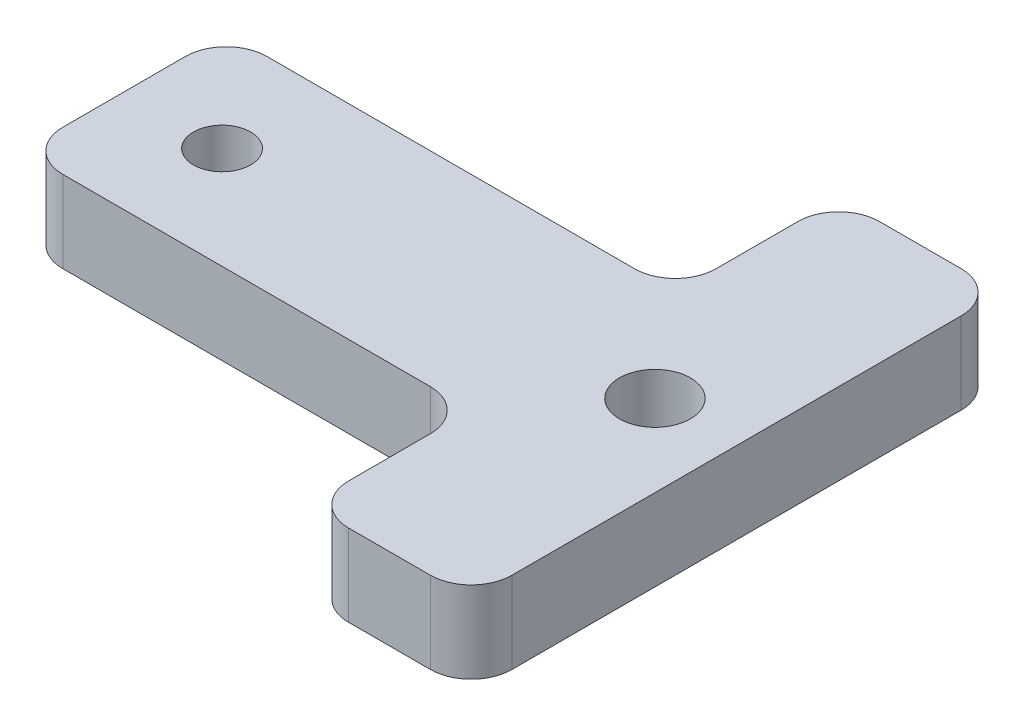
ISO-10303-21;
HEADER;
FILE_DESCRIPTION(('STEP AP214'),'2;1');
FILE_NAME('part.step','',(''),(''),'','','');
FILE_SCHEMA(('AUTOMOTIVE_DESIGN { 1 0 10303 214 1 1 1 1 }'));
ENDSEC;
DATA;
#1=APPLICATION_CONTEXT('core data for automotive mechanical design processes');
#2=APPLICATION_PROTOCOL_DEFINITION('international standard','automotive_design',2000,#1);
#3=PRODUCT_CONTEXT('',#1,'mechanical');
#4=PRODUCT('Part','Part','',(#3));
#5=PRODUCT_RELATED_PRODUCT_CATEGORY('part','',(#4));
#6=PRODUCT_DEFINITION_FORMATION('','',#4);
#7=PRODUCT_DEFINITION_CONTEXT('part definition',#1,'design');
#8=PRODUCT_DEFINITION('design','',#6,#7);
#9=PRODUCT_DEFINITION_SHAPE('','',#8);
#10=(LENGTH_UNIT() NAMED_UNIT(*) SI_UNIT(.MILLI.,.METRE.));
#11=(NAMED_UNIT(*) PLANE_ANGLE_UNIT() SI_UNIT($,.RADIAN.));
#12=(NAMED_UNIT(*) SI_UNIT($,.STERADIAN.) SOLID_ANGLE_UNIT());
#13=UNCERTAINTY_MEASURE_WITH_UNIT(LENGTH_MEASURE(1.E-05),#10,'distance_accuracy_value','');
#14=(GEOMETRIC_REPRESENTATION_CONTEXT(3) GLOBAL_UNCERTAINTY_ASSIGNED_CONTEXT((#13)) GLOBAL_UNIT_ASSIGNED_CONTEXT((#10,
#11,#12)) REPRESENTATION_CONTEXT('',''));
#15=CARTESIAN_POINT('',(0.,0.,0.));
#16=DIRECTION('',(0.,0.,1.));
#17=DIRECTION('',(1.,0.,0.));
#18=AXIS2_PLACEMENT_3D('',#15,#16,#17);
#19=CARTESIAN_POINT('',(-25.5,-0.000999999999999265,0.));
#20=DIRECTION('',(0.,1.,0.));
#21=DIRECTION('',(0.,0.,1.));
#22=AXIS2_PLACEMENT_3D('',#19,#20,#21);
#23=CYLINDRICAL_SURFACE('',#22,3.50000000000001);
#24=CARTESIAN_POINT('',(-25.5,10.,0.));
#25=DIRECTION('',(0.,1.,0.));
#26=DIRECTION('',(0.,0.,1.));
#27=AXIS2_PLACEMENT_3D('',#24,#25,#26);
#28=CIRCLE('',#27,3.50000000000001);
#29=CARTESIAN_POINT('',(-25.5,10.,3.50000000000001));
#30=VERTEX_POINT('',#29);
#31=EDGE_CURVE('E329',#30,#30,#28,.T.);
#32=ORIENTED_EDGE('',*,*,#31,.T.);
#33=EDGE_LOOP('',(#32));
#34=FACE_BOUND('',#33,.T.);
#35=CARTESIAN_POINT('',(-25.5,4.,0.));
#36=DIRECTION('',(0.,-1.,0.));
#37=DIRECTION('',(0.,0.,-1.));
#38=AXIS2_PLACEMENT_3D('',#35,#36,#37);
#39=CIRCLE('',#38,3.50000000000001);
#40=CARTESIAN_POINT('',(-25.5,4.,-3.50000000000001));
#41=VERTEX_POINT('',#40);
#42=EDGE_CURVE('E45',#41,#41,#39,.F.);
#43=ORIENTED_EDGE('',*,*,#42,.F.);
#44=EDGE_LOOP('',(#43));
#45=FACE_BOUND('',#44,.T.);
#46=ADVANCED_FACE('F41',(#34,#45),#23,.F.);
#47=CARTESIAN_POINT('',(17.5,10.,0.));
#48=DIRECTION('',(-1.,0.,0.));
#49=DIRECTION('',(0.,0.,1.));
#50=AXIS2_PLACEMENT_3D('',#47,#48,#49);
#51=PLANE('',#50);
#52=DIRECTION('',(0.,0.,-1.));
#53=VECTOR('',#52,1.);
#54=CARTESIAN_POINT('',(17.5,10.,0.));
#55=LINE('',#54,#53);
#56=CARTESIAN_POINT('',(17.5,10.,-17.5));
#57=VERTEX_POINT('',#56);
#58=CARTESIAN_POINT('',(17.5,10.,-27.5));
#59=VERTEX_POINT('',#58);
#60=EDGE_CURVE('E186',#57,#59,#55,.T.);
#61=ORIENTED_EDGE('',*,*,#60,.T.);
#62=DIRECTION('',(0.,-1.,0.));
#63=VECTOR('',#62,1.);
#64=CARTESIAN_POINT('',(17.5,0.,-27.5));
#65=LINE('',#64,#63);
#66=CARTESIAN_POINT('',(17.5,0.,-27.5));
#67=VERTEX_POINT('',#66);
#68=EDGE_CURVE('E238',#59,#67,#65,.T.);
#69=ORIENTED_EDGE('',*,*,#68,.T.);
#70=DIRECTION('',(0.,0.,-1.));
#71=VECTOR('',#70,1.);
#72=CARTESIAN_POINT('',(17.5,0.,0.));
#73=LINE('',#72,#71);
#74=CARTESIAN_POINT('',(17.5,0.,-17.5));
#75=VERTEX_POINT('',#74);
#76=EDGE_CURVE('E325',#75,#67,#73,.T.);
#77=ORIENTED_EDGE('',*,*,#76,.F.);
#78=DIRECTION('',(0.,-1.,0.));
#79=VECTOR('',#78,1.);
#80=CARTESIAN_POINT('',(17.5,10.,-17.5));
#81=LINE('',#80,#79);
#82=EDGE_CURVE('E235',#75,#57,#81,.F.);
#83=ORIENTED_EDGE('',*,*,#82,.T.);
#84=EDGE_LOOP('',(#61,#69,#77,#83));
#85=FACE_BOUND('',#84,.T.);
#86=ADVANCED_FACE('F357',(#85),#51,.T.);
#87=CARTESIAN_POINT('',(0.,10.,-12.5));
#88=DIRECTION('',(0.,0.,-1.));
#89=DIRECTION('',(-1.,0.,0.));
#90=AXIS2_PLACEMENT_3D('',#87,#88,#89);
#91=PLANE('',#90);
#92=DIRECTION('',(1.,0.,0.));
#93=VECTOR('',#92,1.);
#94=CARTESIAN_POINT('',(0.,10.,-12.5));
#95=LINE('',#94,#93);
#96=CARTESIAN_POINT('',(-32.5,10.,-12.5));
#97=VERTEX_POINT('',#96);
#98=CARTESIAN_POINT('',(12.5,10.,-12.5));
#99=VERTEX_POINT('',#98);
#100=EDGE_CURVE('E192',#97,#99,#95,.T.);
#101=ORIENTED_EDGE('',*,*,#100,.T.);
#102=DIRECTION('',(0.,-1.,0.));
#103=VECTOR('',#102,1.);
#104=CARTESIAN_POINT('',(12.5,0.,-12.5));
#105=LINE('',#104,#103);
#106=CARTESIAN_POINT('',(12.5,0.,-12.5));
#107=VERTEX_POINT('',#106);
#108=EDGE_CURVE('E245',#99,#107,#105,.T.);
#109=ORIENTED_EDGE('',*,*,#108,.T.);
#110=DIRECTION('',(1.,0.,0.));
#111=VECTOR('',#110,1.);
#112=CARTESIAN_POINT('',(0.,0.,-12.5));
#113=LINE('',#112,#111);
#114=CARTESIAN_POINT('',(-32.5,0.,-12.5));
#115=VERTEX_POINT('',#114);
#116=EDGE_CURVE('E328',#115,#107,#113,.T.);
#117=ORIENTED_EDGE('',*,*,#116,.F.);
#118=DIRECTION('',(0.,-1.,0.));
#119=VECTOR('',#118,1.);
#120=CARTESIAN_POINT('',(-32.5,10.,-12.5));
#121=LINE('',#120,#119);
#122=EDGE_CURVE('E242',#115,#97,#121,.F.);
#123=ORIENTED_EDGE('',*,*,#122,.T.);
#124=EDGE_LOOP('',(#101,#109,#117,#123));
#125=FACE_BOUND('',#124,.T.);
#126=ADVANCED_FACE('F363',(#125),#91,.T.);
#127=CARTESIAN_POINT('',(-37.5,10.,0.));
#128=DIRECTION('',(-1.,0.,0.));
#129=DIRECTION('',(0.,0.,1.));
#130=AXIS2_PLACEMENT_3D('',#127,#128,#129);
#131=PLANE('',#130);
#132=DIRECTION('',(0.,0.,-1.));
#133=VECTOR('',#132,1.);
#134=CARTESIAN_POINT('',(-37.5,10.,0.));
#135=LINE('',#134,#133);
#136=CARTESIAN_POINT('',(-37.5,10.,7.49999999999998));
#137=VERTEX_POINT('',#136);
#138=CARTESIAN_POINT('',(-37.5,10.,-7.49999999999998));
#139=VERTEX_POINT('',#138);
#140=EDGE_CURVE('E317',#137,#139,#135,.T.);
#141=ORIENTED_EDGE('',*,*,#140,.T.);
#142=DIRECTION('',(0.,-1.,0.));
#143=VECTOR('',#142,1.);
#144=CARTESIAN_POINT('',(-37.5,10.,-7.49999999999998));
#145=LINE('',#144,#143);
#146=CARTESIAN_POINT('',(-37.5,0.,-7.49999999999998));
#147=VERTEX_POINT('',#146);
#148=EDGE_CURVE('E272',#139,#147,#145,.T.);
#149=ORIENTED_EDGE('',*,*,#148,.T.);
#150=DIRECTION('',(0.,0.,-1.));
#151=VECTOR('',#150,1.);
#152=CARTESIAN_POINT('',(-37.5,0.,0.));
#153=LINE('',#152,#151);
#154=CARTESIAN_POINT('',(-37.5,0.,7.49999999999998));
#155=VERTEX_POINT('',#154);
#156=EDGE_CURVE('E298',#155,#147,#153,.T.);
#157=ORIENTED_EDGE('',*,*,#156,.F.);
#158=DIRECTION('',(0.,-1.,0.));
#159=VECTOR('',#158,1.);
#160=CARTESIAN_POINT('',(-37.5,10.,7.49999999999998));
#161=LINE('',#160,#159);
#162=EDGE_CURVE('E269',#155,#137,#161,.F.);
#163=ORIENTED_EDGE('',*,*,#162,.T.);
#164=EDGE_LOOP('',(#141,#149,#157,#163));
#165=FACE_BOUND('',#164,.T.);
#166=ADVANCED_FACE('F407',(#165),#131,.T.);
#167=CARTESIAN_POINT('',(0.,10.,12.5));
#168=DIRECTION('',(0.,0.,-1.));
#169=DIRECTION('',(-1.,0.,0.));
#170=AXIS2_PLACEMENT_3D('',#167,#168,#169);
#171=PLANE('',#170);
#172=DIRECTION('',(1.,0.,0.));
#173=VECTOR('',#172,1.);
#174=CARTESIAN_POINT('',(0.,0.,12.5));
#175=LINE('',#174,#173);
#176=CARTESIAN_POINT('',(-32.5,0.,12.5));
#177=VERTEX_POINT('',#176);
#178=CARTESIAN_POINT('',(12.5,0.,12.5));
#179=VERTEX_POINT('',#178);
#180=EDGE_CURVE('E286',#177,#179,#175,.T.);
#181=ORIENTED_EDGE('',*,*,#180,.T.);
#182=DIRECTION('',(0.,-1.,0.));
#183=VECTOR('',#182,1.);
#184=CARTESIAN_POINT('',(12.5,10.,12.5));
#185=LINE('',#184,#183);
#186=CARTESIAN_POINT('',(12.5,10.,12.5));
#187=VERTEX_POINT('',#186);
#188=EDGE_CURVE('E266',#179,#187,#185,.F.);
#189=ORIENTED_EDGE('',*,*,#188,.T.);
#190=DIRECTION('',(1.,0.,0.));
#191=VECTOR('',#190,1.);
#192=CARTESIAN_POINT('',(0.,10.,12.5));
#193=LINE('',#192,#191);
#194=CARTESIAN_POINT('',(-32.5,10.,12.5));
#195=VERTEX_POINT('',#194);
#196=EDGE_CURVE('E306',#195,#187,#193,.T.);
#197=ORIENTED_EDGE('',*,*,#196,.F.);
#198=DIRECTION('',(0.,-1.,0.));
#199=VECTOR('',#198,1.);
#200=CARTESIAN_POINT('',(-32.5,0.,12.5));
#201=LINE('',#200,#199);
#202=EDGE_CURVE('E262',#195,#177,#201,.T.);
#203=ORIENTED_EDGE('',*,*,#202,.T.);
#204=EDGE_LOOP('',(#181,#189,#197,#203));
#205=FACE_BOUND('',#204,.T.);
#206=ADVANCED_FACE('F293',(#205),#171,.F.);
#207=CARTESIAN_POINT('',(17.5,10.,0.));
#208=DIRECTION('',(1.,0.,0.));
#209=DIRECTION('',(0.,0.,-1.));
#210=AXIS2_PLACEMENT_3D('',#207,#208,#209);
#211=PLANE('',#210);
#212=DIRECTION('',(0.,0.,1.));
#213=VECTOR('',#212,1.);
#214=CARTESIAN_POINT('',(17.5,0.,0.));
#215=LINE('',#214,#213);
#216=CARTESIAN_POINT('',(17.5,0.,17.5));
#217=VERTEX_POINT('',#216);
#218=CARTESIAN_POINT('',(17.5,0.,27.5));
#219=VERTEX_POINT('',#218);
#220=EDGE_CURVE('E288',#217,#219,#215,.T.);
#221=ORIENTED_EDGE('',*,*,#220,.T.);
#222=DIRECTION('',(0.,-1.,0.));
#223=VECTOR('',#222,1.);
#224=CARTESIAN_POINT('',(17.5,10.,27.5));
#225=LINE('',#224,#223);
#226=CARTESIAN_POINT('',(17.5,10.,27.5));
#227=VERTEX_POINT('',#226);
#228=EDGE_CURVE('E259',#219,#227,#225,.F.);
#229=ORIENTED_EDGE('',*,*,#228,.T.);
#230=DIRECTION('',(0.,0.,1.));
#231=VECTOR('',#230,1.);
#232=CARTESIAN_POINT('',(17.5,10.,0.));
#233=LINE('',#232,#231);
#234=CARTESIAN_POINT('',(17.5,10.,17.5));
#235=VERTEX_POINT('',#234);
#236=EDGE_CURVE('E305',#235,#227,#233,.T.);
#237=ORIENTED_EDGE('',*,*,#236,.F.);
#238=DIRECTION('',(0.,-1.,0.));
#239=VECTOR('',#238,1.);
#240=CARTESIAN_POINT('',(17.5,0.,17.5));
#241=LINE('',#240,#239);
#242=EDGE_CURVE('E255',#235,#217,#241,.T.);
#243=ORIENTED_EDGE('',*,*,#242,.T.);
#244=EDGE_LOOP('',(#221,#229,#237,#243));
#245=FACE_BOUND('',#244,.T.);
#246=ADVANCED_FACE('F308',(#245),#211,.F.);
#247=CARTESIAN_POINT('',(0.,10.,32.5));
#248=DIRECTION('',(0.,0.,1.));
#249=DIRECTION('',(1.,0.,0.));
#250=AXIS2_PLACEMENT_3D('',#247,#248,#249);
#251=PLANE('',#250);
#252=DIRECTION('',(-1.,0.,0.));
#253=VECTOR('',#252,1.);
#254=CARTESIAN_POINT('',(0.,0.,32.5));
#255=LINE('',#254,#253);
#256=CARTESIAN_POINT('',(32.5,0.,32.5));
#257=VERTEX_POINT('',#256);
#258=CARTESIAN_POINT('',(22.5,0.,32.5));
#259=VERTEX_POINT('',#258);
#260=EDGE_CURVE('E194',#257,#259,#255,.T.);
#261=ORIENTED_EDGE('',*,*,#260,.F.);
#262=DIRECTION('',(0.,-1.,0.));
#263=VECTOR('',#262,1.);
#264=CARTESIAN_POINT('',(32.5,10.,32.5));
#265=LINE('',#264,#263);
#266=CARTESIAN_POINT('',(32.5,10.,32.5));
#267=VERTEX_POINT('',#266);
#268=EDGE_CURVE('E65',#257,#267,#265,.F.);
#269=ORIENTED_EDGE('',*,*,#268,.T.);
#270=DIRECTION('',(-1.,0.,0.));
#271=VECTOR('',#270,1.);
#272=CARTESIAN_POINT('',(0.,10.,32.5));
#273=LINE('',#272,#271);
#274=CARTESIAN_POINT('',(22.5,10.,32.5));
#275=VERTEX_POINT('',#274);
#276=EDGE_CURVE('E311',#267,#275,#273,.T.);
#277=ORIENTED_EDGE('',*,*,#276,.T.);
#278=DIRECTION('',(0.,-1.,0.));
#279=VECTOR('',#278,1.);
#280=CARTESIAN_POINT('',(22.5,0.,32.5));
#281=LINE('',#280,#279);
#282=EDGE_CURVE('E249',#275,#259,#281,.T.);
#283=ORIENTED_EDGE('',*,*,#282,.T.);
#284=EDGE_LOOP('',(#261,#269,#277,#283));
#285=FACE_BOUND('',#284,.T.);
#286=ADVANCED_FACE('F339',(#285),#251,.T.);
#287=CARTESIAN_POINT('',(37.5,10.,0.));
#288=DIRECTION('',(-1.,0.,0.));
#289=DIRECTION('',(0.,0.,1.));
#290=AXIS2_PLACEMENT_3D('',#287,#288,#289);
#291=PLANE('',#290);
#292=DIRECTION('',(0.,0.,-1.));
#293=VECTOR('',#292,1.);
#294=CARTESIAN_POINT('',(37.5,0.,0.));
#295=LINE('',#294,#293);
#296=CARTESIAN_POINT('',(37.5,0.,27.5));
#297=VERTEX_POINT('',#296);
#298=CARTESIAN_POINT('',(37.5,0.,-27.5));
#299=VERTEX_POINT('',#298);
#300=EDGE_CURVE('E187',#297,#299,#295,.T.);
#301=ORIENTED_EDGE('',*,*,#300,.T.);
#302=DIRECTION('',(0.,-1.,0.));
#303=VECTOR('',#302,1.);
#304=CARTESIAN_POINT('',(37.5,10.,-27.5));
#305=LINE('',#304,#303);
#306=CARTESIAN_POINT('',(37.5,10.,-27.5));
#307=VERTEX_POINT('',#306);
#308=EDGE_CURVE('E162',#299,#307,#305,.F.);
#309=ORIENTED_EDGE('',*,*,#308,.T.);
#310=DIRECTION('',(0.,0.,-1.));
#311=VECTOR('',#310,1.);
#312=CARTESIAN_POINT('',(37.5,10.,0.));
#313=LINE('',#312,#311);
#314=CARTESIAN_POINT('',(37.5,10.,27.5));
#315=VERTEX_POINT('',#314);
#316=EDGE_CURVE('E315',#315,#307,#313,.T.);
#317=ORIENTED_EDGE('',*,*,#316,.F.);
#318=DIRECTION('',(0.,-1.,0.));
#319=VECTOR('',#318,1.);
#320=CARTESIAN_POINT('',(37.5,0.,27.5));
#321=LINE('',#320,#319);
#322=EDGE_CURVE('E168',#315,#297,#321,.T.);
#323=ORIENTED_EDGE('',*,*,#322,.T.);
#324=EDGE_LOOP('',(#301,#309,#317,#323));
#325=FACE_BOUND('',#324,.T.);
#326=ADVANCED_FACE('F347',(#325),#291,.F.);
#327=CARTESIAN_POINT('',(0.,10.,-32.5));
#328=DIRECTION('',(0.,0.,1.));
#329=DIRECTION('',(1.,0.,0.));
#330=AXIS2_PLACEMENT_3D('',#327,#328,#329);
#331=PLANE('',#330);
#332=DIRECTION('',(-1.,0.,0.));
#333=VECTOR('',#332,1.);
#334=CARTESIAN_POINT('',(0.,10.,-32.5));
#335=LINE('',#334,#333);
#336=CARTESIAN_POINT('',(32.5,10.,-32.5));
#337=VERTEX_POINT('',#336);
#338=CARTESIAN_POINT('',(22.5,10.,-32.5));
#339=VERTEX_POINT('',#338);
#340=EDGE_CURVE('E178',#337,#339,#335,.T.);
#341=ORIENTED_EDGE('',*,*,#340,.F.);
#342=DIRECTION('',(0.,-1.,0.));
#343=VECTOR('',#342,1.);
#344=CARTESIAN_POINT('',(32.5,10.,-32.5));
#345=LINE('',#344,#343);
#346=CARTESIAN_POINT('',(32.5,0.,-32.5));
#347=VERTEX_POINT('',#346);
#348=EDGE_CURVE('E161',#337,#347,#345,.T.);
#349=ORIENTED_EDGE('',*,*,#348,.T.);
#350=DIRECTION('',(-1.,0.,0.));
#351=VECTOR('',#350,1.);
#352=CARTESIAN_POINT('',(0.,0.,-32.5));
#353=LINE('',#352,#351);
#354=CARTESIAN_POINT('',(22.5,0.,-32.5));
#355=VERTEX_POINT('',#354);
#356=EDGE_CURVE('E175',#347,#355,#353,.T.);
#357=ORIENTED_EDGE('',*,*,#356,.T.);
#358=DIRECTION('',(0.,-1.,0.));
#359=VECTOR('',#358,1.);
#360=CARTESIAN_POINT('',(22.5,10.,-32.5));
#361=LINE('',#360,#359);
#362=EDGE_CURVE('E181',#355,#339,#361,.F.);
#363=ORIENTED_EDGE('',*,*,#362,.T.);
#364=EDGE_LOOP('',(#341,#349,#357,#363));
#365=FACE_BOUND('',#364,.T.);
#366=ADVANCED_FACE('F174',(#365),#331,.F.);
#367=CARTESIAN_POINT('',(0.,10.,0.));
#368=DIRECTION('',(0.,1.,0.));
#369=DIRECTION('',(0.,0.,1.));
#370=AXIS2_PLACEMENT_3D('',#367,#368,#369);
#371=PLANE('',#370);
#372=ORIENTED_EDGE('',*,*,#31,.F.);
#373=EDGE_LOOP('',(#372));
#374=FACE_BOUND('',#373,.T.);
#375=CARTESIAN_POINT('',(27.5,10.,0.));
#376=DIRECTION('',(0.,1.,0.));
#377=DIRECTION('',(0.,0.,1.));
#378=AXIS2_PLACEMENT_3D('',#375,#376,#377);
#379=CIRCLE('',#378,4.35);
#380=CARTESIAN_POINT('',(27.5,10.,4.35));
#381=VERTEX_POINT('',#380);
#382=EDGE_CURVE('E392',#381,#381,#379,.T.);
#383=ORIENTED_EDGE('',*,*,#382,.F.);
#384=EDGE_LOOP('',(#383));
#385=FACE_BOUND('',#384,.T.);
#386=ORIENTED_EDGE('',*,*,#316,.T.);
#387=CARTESIAN_POINT('',(32.5,10.,-27.5));
#388=DIRECTION('',(0.,1.,0.));
#389=DIRECTION('',(0.,0.,1.));
#390=AXIS2_PLACEMENT_3D('',#387,#388,#389);
#391=CIRCLE('',#390,5.);
#392=EDGE_CURVE('E232',#307,#337,#391,.T.);
#393=ORIENTED_EDGE('',*,*,#392,.T.);
#394=ORIENTED_EDGE('',*,*,#340,.T.);
#395=CARTESIAN_POINT('',(22.5,10.,-27.5));
#396=DIRECTION('',(0.,1.,0.));
#397=DIRECTION('',(0.,0.,1.));
#398=AXIS2_PLACEMENT_3D('',#395,#396,#397);
#399=CIRCLE('',#398,5.);
#400=EDGE_CURVE('E229',#339,#59,#399,.T.);
#401=ORIENTED_EDGE('',*,*,#400,.T.);
#402=ORIENTED_EDGE('',*,*,#60,.F.);
#403=CARTESIAN_POINT('',(12.5,10.,-17.5));
#404=DIRECTION('',(0.,1.,0.));
#405=DIRECTION('',(0.,0.,1.));
#406=AXIS2_PLACEMENT_3D('',#403,#404,#405);
#407=CIRCLE('',#406,5.);
#408=EDGE_CURVE('E279',#57,#99,#407,.F.);
#409=ORIENTED_EDGE('',*,*,#408,.T.);
#410=ORIENTED_EDGE('',*,*,#100,.F.);
#411=CARTESIAN_POINT('',(-32.5,10.,-7.49999999999998));
#412=DIRECTION('',(0.,1.,0.));
#413=DIRECTION('',(0.,0.,1.));
#414=AXIS2_PLACEMENT_3D('',#411,#412,#413);
#415=CIRCLE('',#414,5.);
#416=EDGE_CURVE('E221',#97,#139,#415,.T.);
#417=ORIENTED_EDGE('',*,*,#416,.T.);
#418=ORIENTED_EDGE('',*,*,#140,.F.);
#419=CARTESIAN_POINT('',(-32.5,10.,7.49999999999998));
#420=DIRECTION('',(0.,1.,0.));
#421=DIRECTION('',(0.,0.,1.));
#422=AXIS2_PLACEMENT_3D('',#419,#420,#421);
#423=CIRCLE('',#422,5.);
#424=EDGE_CURVE('E218',#137,#195,#423,.T.);
#425=ORIENTED_EDGE('',*,*,#424,.T.);
#426=ORIENTED_EDGE('',*,*,#196,.T.);
#427=CARTESIAN_POINT('',(12.5,10.,17.5));
#428=DIRECTION('',(0.,1.,0.));
#429=DIRECTION('',(0.,0.,1.));
#430=AXIS2_PLACEMENT_3D('',#427,#428,#429);
#431=CIRCLE('',#430,5.);
#432=EDGE_CURVE('E11',#187,#235,#431,.F.);
#433=ORIENTED_EDGE('',*,*,#432,.T.);
#434=ORIENTED_EDGE('',*,*,#236,.T.);
#435=CARTESIAN_POINT('',(22.5,10.,27.5));
#436=DIRECTION('',(0.,1.,0.));
#437=DIRECTION('',(0.,0.,1.));
#438=AXIS2_PLACEMENT_3D('',#435,#436,#437);
#439=CIRCLE('',#438,5.);
#440=EDGE_CURVE('E58',#227,#275,#439,.T.);
#441=ORIENTED_EDGE('',*,*,#440,.T.);
#442=ORIENTED_EDGE('',*,*,#276,.F.);
#443=CARTESIAN_POINT('',(32.5,10.,27.5));
#444=DIRECTION('',(0.,1.,0.));
#445=DIRECTION('',(0.,0.,1.));
#446=AXIS2_PLACEMENT_3D('',#443,#444,#445);
#447=CIRCLE('',#446,5.);
#448=EDGE_CURVE('E226',#267,#315,#447,.T.);
#449=ORIENTED_EDGE('',*,*,#448,.T.);
#450=EDGE_LOOP('',(#386,#393,#394,#401,#402,#409,#410,#417,#418,#425,#426,#433,#434,#441,#442,#449));
#451=FACE_BOUND('',#450,.T.);
#452=ADVANCED_FACE('F304',(#374,#385,#451),#371,.T.);
#453=CARTESIAN_POINT('',(0.,0.,0.));
#454=DIRECTION('',(0.,1.,0.));
#455=DIRECTION('',(0.,0.,1.));
#456=AXIS2_PLACEMENT_3D('',#453,#454,#455);
#457=PLANE('',#456);
#458=CARTESIAN_POINT('',(-25.5,0.,0.));
#459=DIRECTION('',(0.,-1.,0.));
#460=DIRECTION('',(0.,0.,-1.));
#461=AXIS2_PLACEMENT_3D('',#458,#459,#460);
#462=CIRCLE('',#461,6.);
#463=CARTESIAN_POINT('',(-25.5,0.,-6.));
#464=VERTEX_POINT('',#463);
#465=EDGE_CURVE('E386',#464,#464,#462,.T.);
#466=ORIENTED_EDGE('',*,*,#465,.F.);
#467=EDGE_LOOP('',(#466));
#468=FACE_BOUND('',#467,.T.);
#469=CARTESIAN_POINT('',(27.5,0.,0.));
#470=DIRECTION('',(0.,1.,0.));
#471=DIRECTION('',(0.,0.,1.));
#472=AXIS2_PLACEMENT_3D('',#469,#470,#471);
#473=CIRCLE('',#472,4.35);
#474=CARTESIAN_POINT('',(27.5,0.,4.35));
#475=VERTEX_POINT('',#474);
#476=EDGE_CURVE('E389',#475,#475,#473,.F.);
#477=ORIENTED_EDGE('',*,*,#476,.F.);
#478=EDGE_LOOP('',(#477));
#479=FACE_BOUND('',#478,.T.);
#480=ORIENTED_EDGE('',*,*,#356,.F.);
#481=CARTESIAN_POINT('',(32.5,0.,-27.5));
#482=DIRECTION('',(0.,1.,0.));
#483=DIRECTION('',(0.,0.,1.));
#484=AXIS2_PLACEMENT_3D('',#481,#482,#483);
#485=CIRCLE('',#484,5.);
#486=EDGE_CURVE('E157',#347,#299,#485,.F.);
#487=ORIENTED_EDGE('',*,*,#486,.T.);
#488=ORIENTED_EDGE('',*,*,#300,.F.);
#489=CARTESIAN_POINT('',(32.5,0.,27.5));
#490=DIRECTION('',(0.,1.,0.));
#491=DIRECTION('',(0.,0.,1.));
#492=AXIS2_PLACEMENT_3D('',#489,#490,#491);
#493=CIRCLE('',#492,5.);
#494=EDGE_CURVE('E208',#297,#257,#493,.F.);
#495=ORIENTED_EDGE('',*,*,#494,.T.);
#496=ORIENTED_EDGE('',*,*,#260,.T.);
#497=CARTESIAN_POINT('',(22.5,0.,27.5));
#498=DIRECTION('',(0.,1.,0.));
#499=DIRECTION('',(0.,0.,1.));
#500=AXIS2_PLACEMENT_3D('',#497,#498,#499);
#501=CIRCLE('',#500,5.);
#502=EDGE_CURVE('E205',#259,#219,#501,.F.);
#503=ORIENTED_EDGE('',*,*,#502,.T.);
#504=ORIENTED_EDGE('',*,*,#220,.F.);
#505=CARTESIAN_POINT('',(12.5,0.,17.5));
#506=DIRECTION('',(0.,1.,0.));
#507=DIRECTION('',(0.,0.,1.));
#508=AXIS2_PLACEMENT_3D('',#505,#506,#507);
#509=CIRCLE('',#508,5.);
#510=EDGE_CURVE('E51',#217,#179,#509,.T.);
#511=ORIENTED_EDGE('',*,*,#510,.T.);
#512=ORIENTED_EDGE('',*,*,#180,.F.);
#513=CARTESIAN_POINT('',(-32.5,0.,7.49999999999998));
#514=DIRECTION('',(0.,1.,0.));
#515=DIRECTION('',(0.,0.,1.));
#516=AXIS2_PLACEMENT_3D('',#513,#514,#515);
#517=CIRCLE('',#516,5.);
#518=EDGE_CURVE('E180',#177,#155,#517,.F.);
#519=ORIENTED_EDGE('',*,*,#518,.T.);
#520=ORIENTED_EDGE('',*,*,#156,.T.);
#521=CARTESIAN_POINT('',(-32.5,0.,-7.49999999999998));
#522=DIRECTION('',(0.,1.,0.));
#523=DIRECTION('',(0.,0.,1.));
#524=AXIS2_PLACEMENT_3D('',#521,#522,#523);
#525=CIRCLE('',#524,5.);
#526=EDGE_CURVE('E202',#147,#115,#525,.F.);
#527=ORIENTED_EDGE('',*,*,#526,.T.);
#528=ORIENTED_EDGE('',*,*,#116,.T.);
#529=CARTESIAN_POINT('',(12.5,0.,-17.5));
#530=DIRECTION('',(0.,1.,0.));
#531=DIRECTION('',(0.,0.,1.));
#532=AXIS2_PLACEMENT_3D('',#529,#530,#531);
#533=CIRCLE('',#532,5.);
#534=EDGE_CURVE('E276',#107,#75,#533,.T.);
#535=ORIENTED_EDGE('',*,*,#534,.T.);
#536=ORIENTED_EDGE('',*,*,#76,.T.);
#537=CARTESIAN_POINT('',(22.5,0.,-27.5));
#538=DIRECTION('',(0.,1.,0.));
#539=DIRECTION('',(0.,0.,1.));
#540=AXIS2_PLACEMENT_3D('',#537,#538,#539);
#541=CIRCLE('',#540,5.);
#542=EDGE_CURVE('E169',#67,#355,#541,.F.);
#543=ORIENTED_EDGE('',*,*,#542,.T.);
#544=EDGE_LOOP('',(#480,#487,#488,#495,#496,#503,#504,#511,#512,#519,#520,#527,#528,#535,#536,#543));
#545=FACE_BOUND('',#544,.T.);
#546=ADVANCED_FACE('F183',(#468,#479,#545),#457,.F.);
#547=CARTESIAN_POINT('',(27.5,-0.000999999999999265,0.));
#548=DIRECTION('',(0.,1.,0.));
#549=DIRECTION('',(0.,0.,1.));
#550=AXIS2_PLACEMENT_3D('',#547,#548,#549);
#551=CYLINDRICAL_SURFACE('',#550,4.35);
#552=ORIENTED_EDGE('',*,*,#382,.T.);
#553=EDGE_LOOP('',(#552));
#554=FACE_BOUND('',#553,.T.);
#555=ORIENTED_EDGE('',*,*,#476,.T.);
#556=EDGE_LOOP('',(#555));
#557=FACE_BOUND('',#556,.T.);
#558=ADVANCED_FACE('F372',(#554,#557),#551,.F.);
#559=CARTESIAN_POINT('',(32.5,10.,-27.5));
#560=DIRECTION('',(0.,-1.,0.));
#561=DIRECTION('',(0.,0.,-1.));
#562=AXIS2_PLACEMENT_3D('',#559,#560,#561);
#563=CYLINDRICAL_SURFACE('',#562,5.);
#564=ORIENTED_EDGE('',*,*,#392,.F.);
#565=ORIENTED_EDGE('',*,*,#308,.F.);
#566=ORIENTED_EDGE('',*,*,#486,.F.);
#567=ORIENTED_EDGE('',*,*,#348,.F.);
#568=EDGE_LOOP('',(#564,#565,#566,#567));
#569=FACE_BOUND('',#568,.T.);
#570=ADVANCED_FACE('F160',(#569),#563,.T.);
#571=CARTESIAN_POINT('',(22.5,10.,-27.5));
#572=DIRECTION('',(0.,1.,0.));
#573=DIRECTION('',(0.,0.,1.));
#574=AXIS2_PLACEMENT_3D('',#571,#572,#573);
#575=CYLINDRICAL_SURFACE('',#574,5.);
#576=ORIENTED_EDGE('',*,*,#400,.F.);
#577=ORIENTED_EDGE('',*,*,#362,.F.);
#578=ORIENTED_EDGE('',*,*,#542,.F.);
#579=ORIENTED_EDGE('',*,*,#68,.F.);
#580=EDGE_LOOP('',(#576,#577,#578,#579));
#581=FACE_BOUND('',#580,.T.);
#582=ADVANCED_FACE('F428',(#581),#575,.T.);
#583=CARTESIAN_POINT('',(12.5,10.,-17.5));
#584=DIRECTION('',(0.,1.,0.));
#585=DIRECTION('',(0.,0.,1.));
#586=AXIS2_PLACEMENT_3D('',#583,#584,#585);
#587=CYLINDRICAL_SURFACE('',#586,5.);
#588=ORIENTED_EDGE('',*,*,#408,.F.);
#589=ORIENTED_EDGE('',*,*,#82,.F.);
#590=ORIENTED_EDGE('',*,*,#534,.F.);
#591=ORIENTED_EDGE('',*,*,#108,.F.);
#592=EDGE_LOOP('',(#588,#589,#590,#591));
#593=FACE_BOUND('',#592,.T.);
#594=ADVANCED_FACE('F421',(#593),#587,.F.);
#595=CARTESIAN_POINT('',(32.5,10.,27.5));
#596=DIRECTION('',(0.,1.,0.));
#597=DIRECTION('',(0.,0.,1.));
#598=AXIS2_PLACEMENT_3D('',#595,#596,#597);
#599=CYLINDRICAL_SURFACE('',#598,5.);
#600=ORIENTED_EDGE('',*,*,#448,.F.);
#601=ORIENTED_EDGE('',*,*,#268,.F.);
#602=ORIENTED_EDGE('',*,*,#494,.F.);
#603=ORIENTED_EDGE('',*,*,#322,.F.);
#604=EDGE_LOOP('',(#600,#601,#602,#603));
#605=FACE_BOUND('',#604,.T.);
#606=ADVANCED_FACE('F343',(#605),#599,.T.);
#607=CARTESIAN_POINT('',(22.5,10.,27.5));
#608=DIRECTION('',(0.,1.,0.));
#609=DIRECTION('',(0.,0.,1.));
#610=AXIS2_PLACEMENT_3D('',#607,#608,#609);
#611=CYLINDRICAL_SURFACE('',#610,5.);
#612=ORIENTED_EDGE('',*,*,#440,.F.);
#613=ORIENTED_EDGE('',*,*,#228,.F.);
#614=ORIENTED_EDGE('',*,*,#502,.F.);
#615=ORIENTED_EDGE('',*,*,#282,.F.);
#616=EDGE_LOOP('',(#612,#613,#614,#615));
#617=FACE_BOUND('',#616,.T.);
#618=ADVANCED_FACE('F440',(#617),#611,.T.);
#619=CARTESIAN_POINT('',(12.5,10.,17.5));
#620=DIRECTION('',(0.,1.,0.));
#621=DIRECTION('',(0.,0.,1.));
#622=AXIS2_PLACEMENT_3D('',#619,#620,#621);
#623=CYLINDRICAL_SURFACE('',#622,5.);
#624=ORIENTED_EDGE('',*,*,#432,.F.);
#625=ORIENTED_EDGE('',*,*,#188,.F.);
#626=ORIENTED_EDGE('',*,*,#510,.F.);
#627=ORIENTED_EDGE('',*,*,#242,.F.);
#628=EDGE_LOOP('',(#624,#625,#626,#627));
#629=FACE_BOUND('',#628,.T.);
#630=ADVANCED_FACE('F301',(#629),#623,.F.);
#631=CARTESIAN_POINT('',(-32.5,10.,-7.49999999999998));
#632=DIRECTION('',(0.,-1.,0.));
#633=DIRECTION('',(0.,0.,-1.));
#634=AXIS2_PLACEMENT_3D('',#631,#632,#633);
#635=CYLINDRICAL_SURFACE('',#634,5.);
#636=ORIENTED_EDGE('',*,*,#416,.F.);
#637=ORIENTED_EDGE('',*,*,#122,.F.);
#638=ORIENTED_EDGE('',*,*,#526,.F.);
#639=ORIENTED_EDGE('',*,*,#148,.F.);
#640=EDGE_LOOP('',(#636,#637,#638,#639));
#641=FACE_BOUND('',#640,.T.);
#642=ADVANCED_FACE('F413',(#641),#635,.T.);
#643=CARTESIAN_POINT('',(-32.5,10.,7.49999999999998));
#644=DIRECTION('',(0.,1.,0.));
#645=DIRECTION('',(0.,0.,1.));
#646=AXIS2_PLACEMENT_3D('',#643,#644,#645);
#647=CYLINDRICAL_SURFACE('',#646,5.);
#648=ORIENTED_EDGE('',*,*,#424,.F.);
#649=ORIENTED_EDGE('',*,*,#162,.F.);
#650=ORIENTED_EDGE('',*,*,#518,.F.);
#651=ORIENTED_EDGE('',*,*,#202,.F.);
#652=EDGE_LOOP('',(#648,#649,#650,#651));
#653=FACE_BOUND('',#652,.T.);
#654=ADVANCED_FACE('F43',(#653),#647,.T.);
#655=CARTESIAN_POINT('',(-25.5,4.,0.));
#656=DIRECTION('',(0.,-1.,0.));
#657=DIRECTION('',(0.,0.,-1.));
#658=AXIS2_PLACEMENT_3D('',#655,#656,#657);
#659=PLANE('',#658);
#660=CARTESIAN_POINT('',(-25.5,4.,0.));
#661=DIRECTION('',(0.,-1.,0.));
#662=DIRECTION('',(0.,0.,-1.));
#663=AXIS2_PLACEMENT_3D('',#660,#661,#662);
#664=CIRCLE('',#663,6.);
#665=CARTESIAN_POINT('',(-25.5,4.,-6.));
#666=VERTEX_POINT('',#665);
#667=EDGE_CURVE('E462',#666,#666,#664,.T.);
#668=ORIENTED_EDGE('',*,*,#667,.T.);
#669=EDGE_LOOP('',(#668));
#670=FACE_BOUND('',#669,.T.);
#671=ORIENTED_EDGE('',*,*,#42,.T.);
#672=EDGE_LOOP('',(#671));
#673=FACE_BOUND('',#672,.T.);
#674=ADVANCED_FACE('F449',(#670,#673),#659,.T.);
#675=CARTESIAN_POINT('',(-25.5,4.,0.));
#676=DIRECTION('',(0.,-1.,0.));
#677=DIRECTION('',(0.,0.,-1.));
#678=AXIS2_PLACEMENT_3D('',#675,#676,#677);
#679=CYLINDRICAL_SURFACE('',#678,6.);
#680=ORIENTED_EDGE('',*,*,#667,.F.);
#681=EDGE_LOOP('',(#680));
#682=FACE_BOUND('',#681,.T.);
#683=ORIENTED_EDGE('',*,*,#465,.T.);
#684=EDGE_LOOP('',(#683));
#685=FACE_BOUND('',#684,.T.);
#686=ADVANCED_FACE('F370',(#682,#685),#679,.F.);
#687=CLOSED_SHELL('',(#46,#86,#126,#166,#206,#246,#286,#326,#366,#452,#546,#558,#570,#582,#594,
#606,#618,#630,#642,#654,#674,#686));
#688=MANIFOLD_SOLID_BREP('B2',#687);
#689=ADVANCED_BREP_SHAPE_REPRESENTATION('',(#18,#688),#14);
#690=SHAPE_DEFINITION_REPRESENTATION(#9,#689);
ENDSEC;
END-ISO-10303-21;
